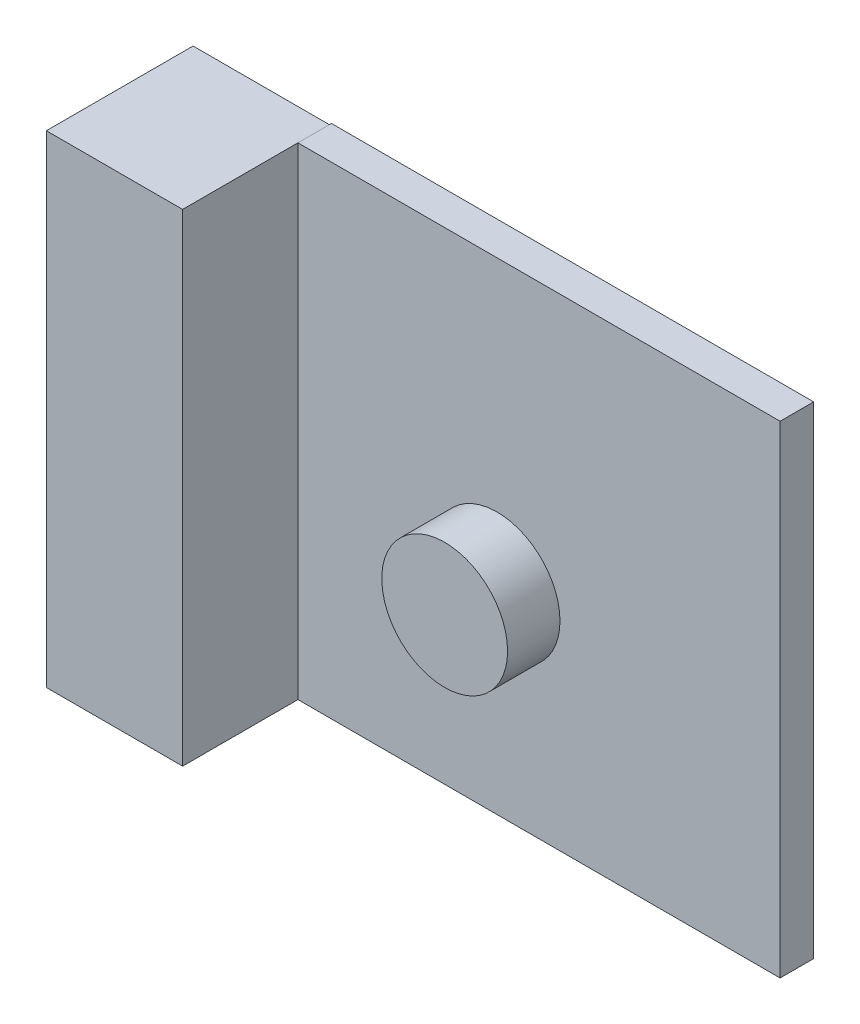
ISO-10303-21;
HEADER;
FILE_DESCRIPTION(('STEP AP214'),'2;1');
FILE_NAME('part.step','',(''),(''),'','','');
FILE_SCHEMA(('AUTOMOTIVE_DESIGN { 1 0 10303 214 1 1 1 1 }'));
ENDSEC;
DATA;
#1=APPLICATION_CONTEXT('core data for automotive mechanical design processes');
#2=APPLICATION_PROTOCOL_DEFINITION('international standard','automotive_design',2000,#1);
#3=PRODUCT_CONTEXT('',#1,'mechanical');
#4=PRODUCT('Part','Part','',(#3));
#5=PRODUCT_RELATED_PRODUCT_CATEGORY('part','',(#4));
#6=PRODUCT_DEFINITION_FORMATION('','',#4);
#7=PRODUCT_DEFINITION_CONTEXT('part definition',#1,'design');
#8=PRODUCT_DEFINITION('design','',#6,#7);
#9=PRODUCT_DEFINITION_SHAPE('','',#8);
#10=(LENGTH_UNIT() NAMED_UNIT(*) SI_UNIT(.MILLI.,.METRE.));
#11=(NAMED_UNIT(*) PLANE_ANGLE_UNIT() SI_UNIT($,.RADIAN.));
#12=(NAMED_UNIT(*) SI_UNIT($,.STERADIAN.) SOLID_ANGLE_UNIT());
#13=UNCERTAINTY_MEASURE_WITH_UNIT(LENGTH_MEASURE(1.E-05),#10,'distance_accuracy_value','');
#14=(GEOMETRIC_REPRESENTATION_CONTEXT(3) GLOBAL_UNCERTAINTY_ASSIGNED_CONTEXT((#13)) GLOBAL_UNIT_ASSIGNED_CONTEXT((#10,
#11,#12)) REPRESENTATION_CONTEXT('',''));
#15=CARTESIAN_POINT('',(0.,0.,0.));
#16=DIRECTION('',(0.,0.,1.));
#17=DIRECTION('',(1.,0.,0.));
#18=AXIS2_PLACEMENT_3D('',#15,#16,#17);
#19=CARTESIAN_POINT('',(46.5,118.5,-32.));
#20=DIRECTION('',(0.,0.,-1.));
#21=DIRECTION('',(-1.,0.,0.));
#22=AXIS2_PLACEMENT_3D('',#19,#20,#21);
#23=PLANE('',#22);
#24=DIRECTION('',(0.,-1.,0.));
#25=VECTOR('',#24,1.);
#26=CARTESIAN_POINT('',(40.,118.5,-32.));
#27=LINE('',#26,#25);
#28=CARTESIAN_POINT('',(40.,141.5,-32.));
#29=VERTEX_POINT('',#28);
#30=CARTESIAN_POINT('',(40.,118.5,-32.));
#31=VERTEX_POINT('',#30);
#32=EDGE_CURVE('E113',#29,#31,#27,.T.);
#33=ORIENTED_EDGE('',*,*,#32,.T.);
#34=DIRECTION('',(-1.,0.,0.));
#35=VECTOR('',#34,1.);
#36=CARTESIAN_POINT('',(46.5,118.5,-32.));
#37=LINE('',#36,#35);
#38=CARTESIAN_POINT('',(46.5,118.5,-32.));
#39=VERTEX_POINT('',#38);
#40=EDGE_CURVE('E12',#39,#31,#37,.T.);
#41=ORIENTED_EDGE('',*,*,#40,.F.);
#42=DIRECTION('',(0.,-1.,0.));
#43=VECTOR('',#42,1.);
#44=CARTESIAN_POINT('',(46.5,118.5,-32.));
#45=LINE('',#44,#43);
#46=CARTESIAN_POINT('',(46.5,141.5,-32.));
#47=VERTEX_POINT('',#46);
#48=EDGE_CURVE('E101',#47,#39,#45,.T.);
#49=ORIENTED_EDGE('',*,*,#48,.F.);
#50=DIRECTION('',(-1.,0.,0.));
#51=VECTOR('',#50,1.);
#52=CARTESIAN_POINT('',(46.5,141.5,-32.));
#53=LINE('',#52,#51);
#54=EDGE_CURVE('E109',#47,#29,#53,.T.);
#55=ORIENTED_EDGE('',*,*,#54,.T.);
#56=EDGE_LOOP('',(#33,#41,#49,#55));
#57=FACE_BOUND('',#56,.T.);
#58=ADVANCED_FACE('F50',(#57),#23,.F.);
#59=CARTESIAN_POINT('',(46.5,118.5,-39.));
#60=DIRECTION('',(0.,1.,0.));
#61=DIRECTION('',(0.,0.,1.));
#62=AXIS2_PLACEMENT_3D('',#59,#60,#61);
#63=PLANE('',#62);
#64=DIRECTION('',(0.,0.,-1.));
#65=VECTOR('',#64,1.);
#66=CARTESIAN_POINT('',(40.,118.5,-39.));
#67=LINE('',#66,#65);
#68=CARTESIAN_POINT('',(40.,118.5,-39.));
#69=VERTEX_POINT('',#68);
#70=EDGE_CURVE('E105',#31,#69,#67,.T.);
#71=ORIENTED_EDGE('',*,*,#70,.T.);
#72=DIRECTION('',(-1.,0.,0.));
#73=VECTOR('',#72,1.);
#74=CARTESIAN_POINT('',(46.5,118.5,-39.));
#75=LINE('',#74,#73);
#76=CARTESIAN_POINT('',(46.5,118.5,-39.));
#77=VERTEX_POINT('',#76);
#78=EDGE_CURVE('E58',#77,#69,#75,.T.);
#79=ORIENTED_EDGE('',*,*,#78,.F.);
#80=DIRECTION('',(0.,0.,-1.));
#81=VECTOR('',#80,1.);
#82=CARTESIAN_POINT('',(46.5,118.5,-39.));
#83=LINE('',#82,#81);
#84=EDGE_CURVE('E96',#39,#77,#83,.T.);
#85=ORIENTED_EDGE('',*,*,#84,.F.);
#86=ORIENTED_EDGE('',*,*,#40,.T.);
#87=EDGE_LOOP('',(#71,#79,#85,#86));
#88=FACE_BOUND('',#87,.T.);
#89=ADVANCED_FACE('F104',(#88),#63,.F.);
#90=CARTESIAN_POINT('',(46.5,118.5,-39.));
#91=DIRECTION('',(0.,0.,1.));
#92=DIRECTION('',(1.,0.,0.));
#93=AXIS2_PLACEMENT_3D('',#90,#91,#92);
#94=PLANE('',#93);
#95=DIRECTION('',(0.,1.,0.));
#96=VECTOR('',#95,1.);
#97=CARTESIAN_POINT('',(40.,118.5,-39.));
#98=LINE('',#97,#96);
#99=CARTESIAN_POINT('',(40.,141.5,-39.));
#100=VERTEX_POINT('',#99);
#101=EDGE_CURVE('E83',#69,#100,#98,.T.);
#102=ORIENTED_EDGE('',*,*,#101,.T.);
#103=DIRECTION('',(-1.,0.,0.));
#104=VECTOR('',#103,1.);
#105=CARTESIAN_POINT('',(46.5,141.5,-39.));
#106=LINE('',#105,#104);
#107=CARTESIAN_POINT('',(46.5,141.5,-39.));
#108=VERTEX_POINT('',#107);
#109=EDGE_CURVE('E106',#108,#100,#106,.T.);
#110=ORIENTED_EDGE('',*,*,#109,.F.);
#111=DIRECTION('',(0.,1.,0.));
#112=VECTOR('',#111,1.);
#113=CARTESIAN_POINT('',(46.5,118.5,-39.));
#114=LINE('',#113,#112);
#115=EDGE_CURVE('E99',#77,#108,#114,.T.);
#116=ORIENTED_EDGE('',*,*,#115,.F.);
#117=ORIENTED_EDGE('',*,*,#78,.T.);
#118=EDGE_LOOP('',(#102,#110,#116,#117));
#119=FACE_BOUND('',#118,.T.);
#120=ADVANCED_FACE('F107',(#119),#94,.F.);
#121=CARTESIAN_POINT('',(46.5,141.5,-39.));
#122=DIRECTION('',(0.,-1.,0.));
#123=DIRECTION('',(0.,0.,-1.));
#124=AXIS2_PLACEMENT_3D('',#121,#122,#123);
#125=PLANE('',#124);
#126=DIRECTION('',(0.,0.,1.));
#127=VECTOR('',#126,1.);
#128=CARTESIAN_POINT('',(40.,141.5,-39.));
#129=LINE('',#128,#127);
#130=EDGE_CURVE('E89',#100,#29,#129,.T.);
#131=ORIENTED_EDGE('',*,*,#130,.T.);
#132=ORIENTED_EDGE('',*,*,#54,.F.);
#133=DIRECTION('',(0.,0.,1.));
#134=VECTOR('',#133,1.);
#135=CARTESIAN_POINT('',(46.5,141.5,-39.));
#136=LINE('',#135,#134);
#137=EDGE_CURVE('E66',#108,#47,#136,.T.);
#138=ORIENTED_EDGE('',*,*,#137,.F.);
#139=ORIENTED_EDGE('',*,*,#109,.T.);
#140=EDGE_LOOP('',(#131,#132,#138,#139));
#141=FACE_BOUND('',#140,.T.);
#142=ADVANCED_FACE('F120',(#141),#125,.F.);
#143=CARTESIAN_POINT('',(46.5,0.,0.));
#144=DIRECTION('',(1.,0.,0.));
#145=DIRECTION('',(0.,0.,-1.));
#146=AXIS2_PLACEMENT_3D('',#143,#144,#145);
#147=PLANE('',#146);
#148=ORIENTED_EDGE('',*,*,#48,.T.);
#149=ORIENTED_EDGE('',*,*,#84,.T.);
#150=ORIENTED_EDGE('',*,*,#115,.T.);
#151=ORIENTED_EDGE('',*,*,#137,.T.);
#152=EDGE_LOOP('',(#148,#149,#150,#151));
#153=FACE_BOUND('',#152,.T.);
#154=ADVANCED_FACE('F97',(#153),#147,.T.);
#155=CARTESIAN_POINT('',(40.,0.,0.));
#156=DIRECTION('',(1.,0.,0.));
#157=DIRECTION('',(0.,0.,-1.));
#158=AXIS2_PLACEMENT_3D('',#155,#156,#157);
#159=PLANE('',#158);
#160=ORIENTED_EDGE('',*,*,#32,.F.);
#161=ORIENTED_EDGE('',*,*,#130,.F.);
#162=ORIENTED_EDGE('',*,*,#101,.F.);
#163=ORIENTED_EDGE('',*,*,#70,.F.);
#164=EDGE_LOOP('',(#160,#161,#162,#163));
#165=FACE_BOUND('',#164,.T.);
#166=ADVANCED_FACE('F123',(#165),#159,.F.);
#167=CLOSED_SHELL('',(#58,#89,#120,#142,#154,#166));
#168=MANIFOLD_SOLID_BREP('B2',#167);
#169=CARTESIAN_POINT('',(69.5,118.5,-37.5));
#170=DIRECTION('',(0.,0.,-1.));
#171=DIRECTION('',(-1.,0.,0.));
#172=AXIS2_PLACEMENT_3D('',#169,#170,#171);
#173=PLANE('',#172);
#174=DIRECTION('',(0.,-1.,0.));
#175=VECTOR('',#174,1.);
#176=CARTESIAN_POINT('',(46.5,118.5,-37.5));
#177=LINE('',#176,#175);
#178=CARTESIAN_POINT('',(46.5,141.5,-37.5));
#179=VERTEX_POINT('',#178);
#180=CARTESIAN_POINT('',(46.5,118.5,-37.5));
#181=VERTEX_POINT('',#180);
#182=EDGE_CURVE('E244',#179,#181,#177,.T.);
#183=ORIENTED_EDGE('',*,*,#182,.T.);
#184=DIRECTION('',(-1.,0.,0.));
#185=VECTOR('',#184,1.);
#186=CARTESIAN_POINT('',(69.5,118.5,-37.5));
#187=LINE('',#186,#185);
#188=CARTESIAN_POINT('',(69.5,118.5,-37.5));
#189=VERTEX_POINT('',#188);
#190=EDGE_CURVE('E48',#189,#181,#187,.T.);
#191=ORIENTED_EDGE('',*,*,#190,.F.);
#192=DIRECTION('',(0.,-1.,0.));
#193=VECTOR('',#192,1.);
#194=CARTESIAN_POINT('',(69.5,118.5,-37.5));
#195=LINE('',#194,#193);
#196=CARTESIAN_POINT('',(69.5,141.5,-37.5));
#197=VERTEX_POINT('',#196);
#198=EDGE_CURVE('E232',#197,#189,#195,.T.);
#199=ORIENTED_EDGE('',*,*,#198,.F.);
#200=DIRECTION('',(-1.,0.,0.));
#201=VECTOR('',#200,1.);
#202=CARTESIAN_POINT('',(69.5,141.5,-37.5));
#203=LINE('',#202,#201);
#204=EDGE_CURVE('E240',#197,#179,#203,.T.);
#205=ORIENTED_EDGE('',*,*,#204,.T.);
#206=EDGE_LOOP('',(#183,#191,#199,#205));
#207=FACE_BOUND('',#206,.T.);
#208=ADVANCED_FACE('F181',(#207),#173,.F.);
#209=CARTESIAN_POINT('',(69.5,118.5,-39.1));
#210=DIRECTION('',(0.,1.,0.));
#211=DIRECTION('',(0.,0.,1.));
#212=AXIS2_PLACEMENT_3D('',#209,#210,#211);
#213=PLANE('',#212);
#214=DIRECTION('',(0.,0.,-1.));
#215=VECTOR('',#214,1.);
#216=CARTESIAN_POINT('',(46.5,118.5,-39.1));
#217=LINE('',#216,#215);
#218=CARTESIAN_POINT('',(46.5,118.5,-39.1));
#219=VERTEX_POINT('',#218);
#220=EDGE_CURVE('E236',#181,#219,#217,.T.);
#221=ORIENTED_EDGE('',*,*,#220,.T.);
#222=DIRECTION('',(-1.,0.,0.));
#223=VECTOR('',#222,1.);
#224=CARTESIAN_POINT('',(69.5,118.5,-39.1));
#225=LINE('',#224,#223);
#226=CARTESIAN_POINT('',(69.5,118.5,-39.1));
#227=VERTEX_POINT('',#226);
#228=EDGE_CURVE('E189',#227,#219,#225,.T.);
#229=ORIENTED_EDGE('',*,*,#228,.F.);
#230=DIRECTION('',(0.,0.,-1.));
#231=VECTOR('',#230,1.);
#232=CARTESIAN_POINT('',(69.5,118.5,-39.1));
#233=LINE('',#232,#231);
#234=EDGE_CURVE('E227',#189,#227,#233,.T.);
#235=ORIENTED_EDGE('',*,*,#234,.F.);
#236=ORIENTED_EDGE('',*,*,#190,.T.);
#237=EDGE_LOOP('',(#221,#229,#235,#236));
#238=FACE_BOUND('',#237,.T.);
#239=ADVANCED_FACE('F235',(#238),#213,.F.);
#240=CARTESIAN_POINT('',(69.5,118.5,-39.1));
#241=DIRECTION('',(0.,0.,1.));
#242=DIRECTION('',(1.,0.,0.));
#243=AXIS2_PLACEMENT_3D('',#240,#241,#242);
#244=PLANE('',#243);
#245=DIRECTION('',(0.,1.,0.));
#246=VECTOR('',#245,1.);
#247=CARTESIAN_POINT('',(46.5,118.5,-39.1));
#248=LINE('',#247,#246);
#249=CARTESIAN_POINT('',(46.5,141.5,-39.1));
#250=VERTEX_POINT('',#249);
#251=EDGE_CURVE('E214',#219,#250,#248,.T.);
#252=ORIENTED_EDGE('',*,*,#251,.T.);
#253=DIRECTION('',(-1.,0.,0.));
#254=VECTOR('',#253,1.);
#255=CARTESIAN_POINT('',(69.5,141.5,-39.1));
#256=LINE('',#255,#254);
#257=CARTESIAN_POINT('',(69.5,141.5,-39.1));
#258=VERTEX_POINT('',#257);
#259=EDGE_CURVE('E237',#258,#250,#256,.T.);
#260=ORIENTED_EDGE('',*,*,#259,.F.);
#261=DIRECTION('',(0.,1.,0.));
#262=VECTOR('',#261,1.);
#263=CARTESIAN_POINT('',(69.5,118.5,-39.1));
#264=LINE('',#263,#262);
#265=EDGE_CURVE('E230',#227,#258,#264,.T.);
#266=ORIENTED_EDGE('',*,*,#265,.F.);
#267=ORIENTED_EDGE('',*,*,#228,.T.);
#268=EDGE_LOOP('',(#252,#260,#266,#267));
#269=FACE_BOUND('',#268,.T.);
#270=ADVANCED_FACE('F238',(#269),#244,.F.);
#271=CARTESIAN_POINT('',(69.5,141.5,-39.1));
#272=DIRECTION('',(0.,-1.,0.));
#273=DIRECTION('',(0.,0.,-1.));
#274=AXIS2_PLACEMENT_3D('',#271,#272,#273);
#275=PLANE('',#274);
#276=DIRECTION('',(0.,0.,1.));
#277=VECTOR('',#276,1.);
#278=CARTESIAN_POINT('',(46.5,141.5,-39.1));
#279=LINE('',#278,#277);
#280=EDGE_CURVE('E220',#250,#179,#279,.T.);
#281=ORIENTED_EDGE('',*,*,#280,.T.);
#282=ORIENTED_EDGE('',*,*,#204,.F.);
#283=DIRECTION('',(0.,0.,1.));
#284=VECTOR('',#283,1.);
#285=CARTESIAN_POINT('',(69.5,141.5,-39.1));
#286=LINE('',#285,#284);
#287=EDGE_CURVE('E197',#258,#197,#286,.T.);
#288=ORIENTED_EDGE('',*,*,#287,.F.);
#289=ORIENTED_EDGE('',*,*,#259,.T.);
#290=EDGE_LOOP('',(#281,#282,#288,#289));
#291=FACE_BOUND('',#290,.T.);
#292=ADVANCED_FACE('F251',(#291),#275,.F.);
#293=CARTESIAN_POINT('',(69.5,0.,0.));
#294=DIRECTION('',(1.,0.,0.));
#295=DIRECTION('',(0.,0.,-1.));
#296=AXIS2_PLACEMENT_3D('',#293,#294,#295);
#297=PLANE('',#296);
#298=ORIENTED_EDGE('',*,*,#198,.T.);
#299=ORIENTED_EDGE('',*,*,#234,.T.);
#300=ORIENTED_EDGE('',*,*,#265,.T.);
#301=ORIENTED_EDGE('',*,*,#287,.T.);
#302=EDGE_LOOP('',(#298,#299,#300,#301));
#303=FACE_BOUND('',#302,.T.);
#304=ADVANCED_FACE('F228',(#303),#297,.T.);
#305=CARTESIAN_POINT('',(46.5,0.,0.));
#306=DIRECTION('',(1.,0.,0.));
#307=DIRECTION('',(0.,0.,-1.));
#308=AXIS2_PLACEMENT_3D('',#305,#306,#307);
#309=PLANE('',#308);
#310=ORIENTED_EDGE('',*,*,#182,.F.);
#311=ORIENTED_EDGE('',*,*,#280,.F.);
#312=ORIENTED_EDGE('',*,*,#251,.F.);
#313=ORIENTED_EDGE('',*,*,#220,.F.);
#314=EDGE_LOOP('',(#310,#311,#312,#313));
#315=FACE_BOUND('',#314,.T.);
#316=ADVANCED_FACE('F254',(#315),#309,.F.);
#317=CLOSED_SHELL('',(#208,#239,#270,#292,#304,#316));
#318=MANIFOLD_SOLID_BREP('B6',#317);
#319=CARTESIAN_POINT('',(58.,130.,-33.));
#320=DIRECTION('',(0.,0.,-1.));
#321=DIRECTION('',(-1.,0.,0.));
#322=AXIS2_PLACEMENT_3D('',#319,#320,#321);
#323=CYLINDRICAL_SURFACE('',#322,3.);
#324=CARTESIAN_POINT('',(58.,130.,-33.));
#325=DIRECTION('',(0.,0.,1.));
#326=DIRECTION('',(1.,0.,0.));
#327=AXIS2_PLACEMENT_3D('',#324,#325,#326);
#328=CIRCLE('',#327,3.);
#329=CARTESIAN_POINT('',(61.,130.,-33.));
#330=VERTEX_POINT('',#329);
#331=EDGE_CURVE('E180',#330,#330,#328,.T.);
#332=ORIENTED_EDGE('',*,*,#331,.F.);
#333=EDGE_LOOP('',(#332));
#334=FACE_BOUND('',#333,.T.);
#335=CARTESIAN_POINT('',(58.,130.,-35.5));
#336=DIRECTION('',(0.,0.,1.));
#337=DIRECTION('',(1.,0.,0.));
#338=AXIS2_PLACEMENT_3D('',#335,#336,#337);
#339=CIRCLE('',#338,3.);
#340=CARTESIAN_POINT('',(61.,130.,-35.5));
#341=VERTEX_POINT('',#340);
#342=EDGE_CURVE('E308',#341,#341,#339,.T.);
#343=ORIENTED_EDGE('',*,*,#342,.T.);
#344=EDGE_LOOP('',(#343));
#345=FACE_BOUND('',#344,.T.);
#346=ADVANCED_FACE('F305',(#334,#345),#323,.T.);
#347=CARTESIAN_POINT('',(58.,130.,-33.));
#348=DIRECTION('',(0.,0.,1.));
#349=DIRECTION('',(1.,0.,0.));
#350=AXIS2_PLACEMENT_3D('',#347,#348,#349);
#351=PLANE('',#350);
#352=ORIENTED_EDGE('',*,*,#331,.T.);
#353=EDGE_LOOP('',(#352));
#354=FACE_BOUND('',#353,.T.);
#355=ADVANCED_FACE('F320',(#354),#351,.T.);
#356=CARTESIAN_POINT('',(58.,130.,-35.5));
#357=DIRECTION('',(0.,0.,1.));
#358=DIRECTION('',(1.,0.,0.));
#359=AXIS2_PLACEMENT_3D('',#356,#357,#358);
#360=PLANE('',#359);
#361=ORIENTED_EDGE('',*,*,#342,.F.);
#362=EDGE_LOOP('',(#361));
#363=FACE_BOUND('',#362,.T.);
#364=ADVANCED_FACE('F318',(#363),#360,.F.);
#365=CLOSED_SHELL('',(#346,#355,#364));
#366=MANIFOLD_SOLID_BREP('B42',#365);
#367=ADVANCED_BREP_SHAPE_REPRESENTATION('',(#18,#168,#318,#366),#14);
#368=SHAPE_DEFINITION_REPRESENTATION(#9,#367);
ENDSEC;
END-ISO-10303-21;
